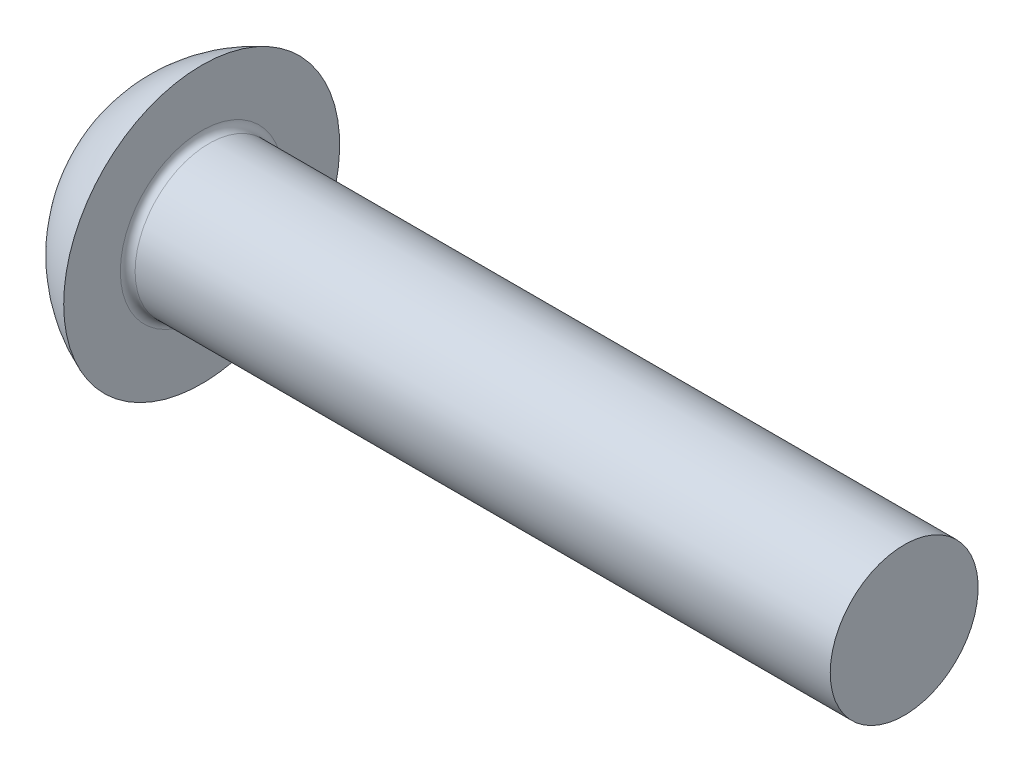
ISO-10303-21;
HEADER;
FILE_DESCRIPTION(('STEP AP214'),'2;1');
FILE_NAME('part.step','',(''),(''),'','','');
FILE_SCHEMA(('AUTOMOTIVE_DESIGN { 1 0 10303 214 1 1 1 1 }'));
ENDSEC;
DATA;
#1=APPLICATION_CONTEXT('core data for automotive mechanical design processes');
#2=APPLICATION_PROTOCOL_DEFINITION('international standard','automotive_design',2000,#1);
#3=PRODUCT_CONTEXT('',#1,'mechanical');
#4=PRODUCT('Part','Part','',(#3));
#5=PRODUCT_RELATED_PRODUCT_CATEGORY('part','',(#4));
#6=PRODUCT_DEFINITION_FORMATION('','',#4);
#7=PRODUCT_DEFINITION_CONTEXT('part definition',#1,'design');
#8=PRODUCT_DEFINITION('design','',#6,#7);
#9=PRODUCT_DEFINITION_SHAPE('','',#8);
#10=(LENGTH_UNIT() NAMED_UNIT(*) SI_UNIT(.MILLI.,.METRE.));
#11=(NAMED_UNIT(*) PLANE_ANGLE_UNIT() SI_UNIT($,.RADIAN.));
#12=(NAMED_UNIT(*) SI_UNIT($,.STERADIAN.) SOLID_ANGLE_UNIT());
#13=UNCERTAINTY_MEASURE_WITH_UNIT(LENGTH_MEASURE(1.E-05),#10,'distance_accuracy_value','');
#14=(GEOMETRIC_REPRESENTATION_CONTEXT(3) GLOBAL_UNCERTAINTY_ASSIGNED_CONTEXT((#13)) GLOBAL_UNIT_ASSIGNED_CONTEXT((#10,
#11,#12)) REPRESENTATION_CONTEXT('',''));
#15=CARTESIAN_POINT('',(0.,0.,0.));
#16=DIRECTION('',(0.,0.,1.));
#17=DIRECTION('',(1.,0.,0.));
#18=AXIS2_PLACEMENT_3D('',#15,#16,#17);
#19=CARTESIAN_POINT('',(6.,0.,0.));
#20=DIRECTION('',(-1.,0.,0.));
#21=DIRECTION('',(0.,1.,0.));
#22=AXIS2_PLACEMENT_3D('',#19,#20,#21);
#23=SPHERICAL_SURFACE('',#22,6.);
#24=CARTESIAN_POINT('',(3.84,0.,0.));
#25=DIRECTION('',(-1.,0.,0.));
#26=DIRECTION('',(0.,0.,1.));
#27=AXIS2_PLACEMENT_3D('',#24,#25,#26);
#28=CIRCLE('',#27,5.59771381905149);
#29=CARTESIAN_POINT('',(3.84,0.,5.59771381905149));
#30=VERTEX_POINT('',#29);
#31=EDGE_CURVE('E10',#30,#30,#28,.T.);
#32=ORIENTED_EDGE('',*,*,#31,.T.);
#33=EDGE_LOOP('',(#32));
#34=FACE_BOUND('',#33,.T.);
#35=ADVANCED_FACE('F40',(#34),#23,.T.);
#36=CARTESIAN_POINT('',(3.84,5.59771381905149,0.));
#37=DIRECTION('',(-1.,0.,0.));
#38=DIRECTION('',(0.,0.,1.));
#39=AXIS2_PLACEMENT_3D('',#36,#37,#38);
#40=PLANE('',#39);
#41=ORIENTED_EDGE('',*,*,#31,.F.);
#42=EDGE_LOOP('',(#41));
#43=FACE_BOUND('',#42,.T.);
#44=CARTESIAN_POINT('',(3.84,0.,0.));
#45=DIRECTION('',(-1.,0.,0.));
#46=DIRECTION('',(0.,0.,1.));
#47=AXIS2_PLACEMENT_3D('',#44,#45,#46);
#48=CIRCLE('',#47,3.3);
#49=CARTESIAN_POINT('',(3.84,0.,3.3));
#50=VERTEX_POINT('',#49);
#51=EDGE_CURVE('E43',#50,#50,#48,.T.);
#52=ORIENTED_EDGE('',*,*,#51,.T.);
#53=EDGE_LOOP('',(#52));
#54=FACE_BOUND('',#53,.T.);
#55=ADVANCED_FACE('F69',(#43,#54),#40,.F.);
#56=CARTESIAN_POINT('',(4.14,0.,0.));
#57=DIRECTION('',(-1.,0.,0.));
#58=DIRECTION('',(0.,0.,1.));
#59=AXIS2_PLACEMENT_3D('',#56,#57,#58);
#60=TOROIDAL_SURFACE('',#59,3.3,0.300000000000002);
#61=ORIENTED_EDGE('',*,*,#51,.F.);
#62=EDGE_LOOP('',(#61));
#63=FACE_BOUND('',#62,.T.);
#64=CARTESIAN_POINT('',(4.14000000000001,0.,0.));
#65=DIRECTION('',(-1.,0.,0.));
#66=DIRECTION('',(0.,0.,1.));
#67=AXIS2_PLACEMENT_3D('',#64,#65,#66);
#68=CIRCLE('',#67,3.);
#69=CARTESIAN_POINT('',(4.14000000000001,0.,3.));
#70=VERTEX_POINT('',#69);
#71=EDGE_CURVE('E50',#70,#70,#68,.T.);
#72=ORIENTED_EDGE('',*,*,#71,.T.);
#73=EDGE_LOOP('',(#72));
#74=FACE_BOUND('',#73,.T.);
#75=ADVANCED_FACE('F63',(#63,#74),#60,.F.);
#76=CARTESIAN_POINT('',(-30.7302294197031,0.,0.));
#77=DIRECTION('',(-1.,0.,0.));
#78=DIRECTION('',(0.,0.,1.));
#79=AXIS2_PLACEMENT_3D('',#76,#77,#78);
#80=CYLINDRICAL_SURFACE('',#79,3.);
#81=ORIENTED_EDGE('',*,*,#71,.F.);
#82=EDGE_LOOP('',(#81));
#83=FACE_BOUND('',#82,.T.);
#84=CARTESIAN_POINT('',(32.34,0.,0.));
#85=DIRECTION('',(-1.,0.,0.));
#86=DIRECTION('',(0.,0.,1.));
#87=AXIS2_PLACEMENT_3D('',#84,#85,#86);
#88=CIRCLE('',#87,3.);
#89=CARTESIAN_POINT('',(32.34,0.,3.));
#90=VERTEX_POINT('',#89);
#91=EDGE_CURVE('E51',#90,#90,#88,.T.);
#92=ORIENTED_EDGE('',*,*,#91,.T.);
#93=EDGE_LOOP('',(#92));
#94=FACE_BOUND('',#93,.T.);
#95=ADVANCED_FACE('F60',(#83,#94),#80,.T.);
#96=CARTESIAN_POINT('',(32.34,3.,0.));
#97=DIRECTION('',(-1.,0.,0.));
#98=DIRECTION('',(0.,0.,1.));
#99=AXIS2_PLACEMENT_3D('',#96,#97,#98);
#100=PLANE('',#99);
#101=ORIENTED_EDGE('',*,*,#91,.F.);
#102=EDGE_LOOP('',(#101));
#103=FACE_BOUND('',#102,.T.);
#104=ADVANCED_FACE('F56',(#103),#100,.F.);
#105=CLOSED_SHELL('',(#35,#55,#75,#95,#104));
#106=MANIFOLD_SOLID_BREP('B2',#105);
#107=ADVANCED_BREP_SHAPE_REPRESENTATION('',(#18,#106),#14);
#108=SHAPE_DEFINITION_REPRESENTATION(#9,#107);
ENDSEC;
END-ISO-10303-21;
